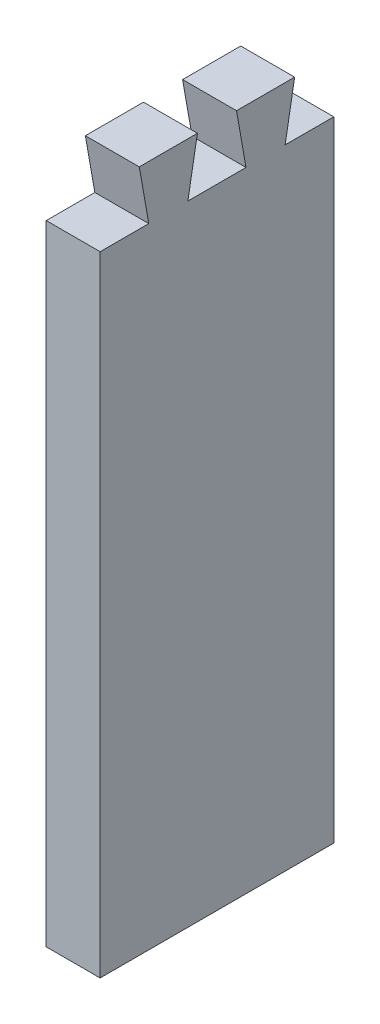
ISO-10303-21;
HEADER;
FILE_DESCRIPTION(('STEP AP214'),'2;1');
FILE_NAME('part.step','',(''),(''),'','','');
FILE_SCHEMA(('AUTOMOTIVE_DESIGN { 1 0 10303 214 1 1 1 1 }'));
ENDSEC;
DATA;
#1=APPLICATION_CONTEXT('core data for automotive mechanical design processes');
#2=APPLICATION_PROTOCOL_DEFINITION('international standard','automotive_design',2000,#1);
#3=PRODUCT_CONTEXT('',#1,'mechanical');
#4=PRODUCT('Part','Part','',(#3));
#5=PRODUCT_RELATED_PRODUCT_CATEGORY('part','',(#4));
#6=PRODUCT_DEFINITION_FORMATION('','',#4);
#7=PRODUCT_DEFINITION_CONTEXT('part definition',#1,'design');
#8=PRODUCT_DEFINITION('design','',#6,#7);
#9=PRODUCT_DEFINITION_SHAPE('','',#8);
#10=(LENGTH_UNIT() NAMED_UNIT(*) SI_UNIT(.MILLI.,.METRE.));
#11=(NAMED_UNIT(*) PLANE_ANGLE_UNIT() SI_UNIT($,.RADIAN.));
#12=(NAMED_UNIT(*) SI_UNIT($,.STERADIAN.) SOLID_ANGLE_UNIT());
#13=UNCERTAINTY_MEASURE_WITH_UNIT(LENGTH_MEASURE(1.E-05),#10,'distance_accuracy_value','');
#14=(GEOMETRIC_REPRESENTATION_CONTEXT(3) GLOBAL_UNCERTAINTY_ASSIGNED_CONTEXT((#13)) GLOBAL_UNIT_ASSIGNED_CONTEXT((#10,
#11,#12)) REPRESENTATION_CONTEXT('',''));
#15=CARTESIAN_POINT('',(0.,0.,0.));
#16=DIRECTION('',(0.,0.,1.));
#17=DIRECTION('',(1.,0.,0.));
#18=AXIS2_PLACEMENT_3D('',#15,#16,#17);
#19=CARTESIAN_POINT('',(-3.,-155.,0.));
#20=DIRECTION('',(0.,-1.,0.));
#21=DIRECTION('',(0.,0.,-1.));
#22=AXIS2_PLACEMENT_3D('',#19,#20,#21);
#23=PLANE('',#22);
#24=DIRECTION('',(0.,0.,-1.));
#25=VECTOR('',#24,1.);
#26=CARTESIAN_POINT('',(-3.,-155.,0.));
#27=LINE('',#26,#25);
#28=CARTESIAN_POINT('',(-3.,-155.,51.66));
#29=VERTEX_POINT('',#28);
#30=CARTESIAN_POINT('',(-3.,-155.,51.46));
#31=VERTEX_POINT('',#30);
#32=EDGE_CURVE('E109',#29,#31,#27,.T.);
#33=ORIENTED_EDGE('',*,*,#32,.T.);
#34=CARTESIAN_POINT('',(0.,-155.,51.46));
#35=DIRECTION('',(0.,-1.,0.));
#36=DIRECTION('',(0.,0.,-1.));
#37=AXIS2_PLACEMENT_3D('',#34,#35,#36);
#38=CIRCLE('',#37,3.);
#39=CARTESIAN_POINT('',(0.,-155.,48.46));
#40=VERTEX_POINT('',#39);
#41=EDGE_CURVE('E104',#31,#40,#38,.T.);
#42=ORIENTED_EDGE('',*,*,#41,.T.);
#43=DIRECTION('',(0.,0.,-1.));
#44=VECTOR('',#43,1.);
#45=CARTESIAN_POINT('',(0.,-155.,0.));
#46=LINE('',#45,#44);
#47=CARTESIAN_POINT('',(0.,-155.,54.66));
#48=VERTEX_POINT('',#47);
#49=EDGE_CURVE('E97',#48,#40,#46,.T.);
#50=ORIENTED_EDGE('',*,*,#49,.F.);
#51=CARTESIAN_POINT('',(0.,-155.,51.66));
#52=DIRECTION('',(0.,-1.,0.));
#53=DIRECTION('',(0.,0.,-1.));
#54=AXIS2_PLACEMENT_3D('',#51,#52,#53);
#55=CIRCLE('',#54,3.);
#56=EDGE_CURVE('E106',#48,#29,#55,.T.);
#57=ORIENTED_EDGE('',*,*,#56,.T.);
#58=EDGE_LOOP('',(#33,#42,#50,#57));
#59=FACE_BOUND('',#58,.T.);
#60=ADVANCED_FACE('F45',(#59),#23,.T.);
#61=CARTESIAN_POINT('',(-3.,155.,0.));
#62=DIRECTION('',(0.,-1.,0.));
#63=DIRECTION('',(0.,0.,-1.));
#64=AXIS2_PLACEMENT_3D('',#61,#62,#63);
#65=PLANE('',#64);
#66=DIRECTION('',(0.,0.,-1.));
#67=VECTOR('',#66,1.);
#68=CARTESIAN_POINT('',(0.,155.,0.));
#69=LINE('',#68,#67);
#70=CARTESIAN_POINT('',(0.,155.,54.66));
#71=VERTEX_POINT('',#70);
#72=CARTESIAN_POINT('',(0.,155.,48.46));
#73=VERTEX_POINT('',#72);
#74=EDGE_CURVE('E83',#71,#73,#69,.T.);
#75=ORIENTED_EDGE('',*,*,#74,.T.);
#76=CARTESIAN_POINT('',(0.,155.,51.46));
#77=DIRECTION('',(0.,-1.,0.));
#78=DIRECTION('',(0.,0.,-1.));
#79=AXIS2_PLACEMENT_3D('',#76,#77,#78);
#80=CIRCLE('',#79,3.);
#81=CARTESIAN_POINT('',(-3.,155.,51.46));
#82=VERTEX_POINT('',#81);
#83=EDGE_CURVE('E12',#73,#82,#80,.F.);
#84=ORIENTED_EDGE('',*,*,#83,.T.);
#85=DIRECTION('',(0.,0.,-1.));
#86=VECTOR('',#85,1.);
#87=CARTESIAN_POINT('',(-3.,155.,0.));
#88=LINE('',#87,#86);
#89=CARTESIAN_POINT('',(-3.,155.,51.66));
#90=VERTEX_POINT('',#89);
#91=EDGE_CURVE('E114',#90,#82,#88,.T.);
#92=ORIENTED_EDGE('',*,*,#91,.F.);
#93=CARTESIAN_POINT('',(0.,155.,51.66));
#94=DIRECTION('',(0.,-1.,0.));
#95=DIRECTION('',(0.,0.,-1.));
#96=AXIS2_PLACEMENT_3D('',#93,#94,#95);
#97=CIRCLE('',#96,3.);
#98=EDGE_CURVE('E53',#90,#71,#97,.F.);
#99=ORIENTED_EDGE('',*,*,#98,.T.);
#100=EDGE_LOOP('',(#75,#84,#92,#99));
#101=FACE_BOUND('',#100,.T.);
#102=ADVANCED_FACE('F85',(#101),#65,.F.);
#103=CARTESIAN_POINT('',(-3.,0.,0.));
#104=DIRECTION('',(1.,0.,0.));
#105=DIRECTION('',(0.,0.,-1.));
#106=AXIS2_PLACEMENT_3D('',#103,#104,#105);
#107=PLANE('',#106);
#108=ORIENTED_EDGE('',*,*,#91,.T.);
#109=DIRECTION('',(0.,-1.,0.));
#110=VECTOR('',#109,1.);
#111=CARTESIAN_POINT('',(-3.,0.,51.46));
#112=LINE('',#111,#110);
#113=EDGE_CURVE('E103',#82,#31,#112,.T.);
#114=ORIENTED_EDGE('',*,*,#113,.T.);
#115=ORIENTED_EDGE('',*,*,#32,.F.);
#116=DIRECTION('',(0.,-1.,0.));
#117=VECTOR('',#116,1.);
#118=CARTESIAN_POINT('',(-3.,155.,51.66));
#119=LINE('',#118,#117);
#120=EDGE_CURVE('E65',#29,#90,#119,.F.);
#121=ORIENTED_EDGE('',*,*,#120,.T.);
#122=EDGE_LOOP('',(#108,#114,#115,#121));
#123=FACE_BOUND('',#122,.T.);
#124=ADVANCED_FACE('F128',(#123),#107,.F.);
#125=CARTESIAN_POINT('',(0.,0.,0.));
#126=DIRECTION('',(1.,0.,0.));
#127=DIRECTION('',(0.,0.,-1.));
#128=AXIS2_PLACEMENT_3D('',#125,#126,#127);
#129=PLANE('',#128);
#130=DIRECTION('',(0.,-1.,0.));
#131=VECTOR('',#130,1.);
#132=CARTESIAN_POINT('',(0.,0.,48.46));
#133=LINE('',#132,#131);
#134=EDGE_CURVE('E91',#73,#40,#133,.T.);
#135=ORIENTED_EDGE('',*,*,#134,.F.);
#136=ORIENTED_EDGE('',*,*,#74,.F.);
#137=DIRECTION('',(0.,-1.,0.));
#138=VECTOR('',#137,1.);
#139=CARTESIAN_POINT('',(0.,0.,54.66));
#140=LINE('',#139,#138);
#141=EDGE_CURVE('E90',#71,#48,#140,.T.);
#142=ORIENTED_EDGE('',*,*,#141,.T.);
#143=ORIENTED_EDGE('',*,*,#49,.T.);
#144=EDGE_LOOP('',(#135,#136,#142,#143));
#145=FACE_BOUND('',#144,.T.);
#146=ADVANCED_FACE('F95',(#145),#129,.T.);
#147=CARTESIAN_POINT('',(0.,0.,51.46));
#148=DIRECTION('',(0.,-1.,0.));
#149=DIRECTION('',(0.,0.,-1.));
#150=AXIS2_PLACEMENT_3D('',#147,#148,#149);
#151=CYLINDRICAL_SURFACE('',#150,3.);
#152=ORIENTED_EDGE('',*,*,#83,.F.);
#153=ORIENTED_EDGE('',*,*,#134,.T.);
#154=ORIENTED_EDGE('',*,*,#41,.F.);
#155=ORIENTED_EDGE('',*,*,#113,.F.);
#156=EDGE_LOOP('',(#152,#153,#154,#155));
#157=FACE_BOUND('',#156,.T.);
#158=ADVANCED_FACE('F101',(#157),#151,.T.);
#159=CARTESIAN_POINT('',(0.,0.,51.66));
#160=DIRECTION('',(0.,1.,0.));
#161=DIRECTION('',(0.,0.,1.));
#162=AXIS2_PLACEMENT_3D('',#159,#160,#161);
#163=CYLINDRICAL_SURFACE('',#162,3.);
#164=ORIENTED_EDGE('',*,*,#98,.F.);
#165=ORIENTED_EDGE('',*,*,#120,.F.);
#166=ORIENTED_EDGE('',*,*,#56,.F.);
#167=ORIENTED_EDGE('',*,*,#141,.F.);
#168=EDGE_LOOP('',(#164,#165,#166,#167));
#169=FACE_BOUND('',#168,.T.);
#170=ADVANCED_FACE('F47',(#169),#163,.T.);
#171=CLOSED_SHELL('',(#60,#102,#124,#146,#158,#170));
#172=MANIFOLD_SOLID_BREP('B2',#171);
#173=CARTESIAN_POINT('',(-30.,0.,0.));
#174=DIRECTION('',(1.,0.,0.));
#175=DIRECTION('',(0.,0.,-1.));
#176=AXIS2_PLACEMENT_3D('',#173,#174,#175);
#177=PLANE('',#176);
#178=DIRECTION('',(0.,0.,-1.));
#179=VECTOR('',#178,1.);
#180=CARTESIAN_POINT('',(-30.,130.,0.));
#181=LINE('',#180,#179);
#182=CARTESIAN_POINT('',(-30.,130.,-38.65));
#183=VERTEX_POINT('',#182);
#184=CARTESIAN_POINT('',(-30.,130.,-48.65));
#185=VERTEX_POINT('',#184);
#186=EDGE_CURVE('E371',#183,#185,#181,.T.);
#187=ORIENTED_EDGE('',*,*,#186,.T.);
#188=DIRECTION('',(0.,1.,0.));
#189=VECTOR('',#188,1.);
#190=CARTESIAN_POINT('',(-30.,-160.,-48.65));
#191=LINE('',#190,#189);
#192=CARTESIAN_POINT('',(-30.,-160.,-48.65));
#193=VERTEX_POINT('',#192);
#194=EDGE_CURVE('E329',#193,#185,#191,.T.);
#195=ORIENTED_EDGE('',*,*,#194,.F.);
#196=DIRECTION('',(0.,0.,-1.));
#197=VECTOR('',#196,1.);
#198=CARTESIAN_POINT('',(-30.,-160.,0.));
#199=LINE('',#198,#197);
#200=CARTESIAN_POINT('',(-30.,-160.,-38.65));
#201=VERTEX_POINT('',#200);
#202=EDGE_CURVE('E364',#201,#193,#199,.T.);
#203=ORIENTED_EDGE('',*,*,#202,.F.);
#204=DIRECTION('',(0.,1.,0.));
#205=VECTOR('',#204,1.);
#206=CARTESIAN_POINT('',(-30.,0.,-38.65));
#207=LINE('',#206,#205);
#208=EDGE_CURVE('E360',#201,#183,#207,.T.);
#209=ORIENTED_EDGE('',*,*,#208,.T.);
#210=EDGE_LOOP('',(#187,#195,#203,#209));
#211=FACE_BOUND('',#210,.T.);
#212=ADVANCED_FACE('F169',(#211),#177,.F.);
#213=CARTESIAN_POINT('',(0.,0.,0.));
#214=DIRECTION('',(1.,0.,0.));
#215=DIRECTION('',(0.,0.,-1.));
#216=AXIS2_PLACEMENT_3D('',#213,#214,#215);
#217=PLANE('',#216);
#218=DIRECTION('',(0.,1.,0.));
#219=VECTOR('',#218,1.);
#220=CARTESIAN_POINT('',(0.,0.,-38.65));
#221=LINE('',#220,#219);
#222=CARTESIAN_POINT('',(0.,-160.,-38.65));
#223=VERTEX_POINT('',#222);
#224=CARTESIAN_POINT('',(0.,130.,-38.65));
#225=VERTEX_POINT('',#224);
#226=EDGE_CURVE('E355',#223,#225,#221,.T.);
#227=ORIENTED_EDGE('',*,*,#226,.F.);
#228=DIRECTION('',(0.,0.,-1.));
#229=VECTOR('',#228,1.);
#230=CARTESIAN_POINT('',(0.,-160.,0.));
#231=LINE('',#230,#229);
#232=CARTESIAN_POINT('',(0.,-160.,35.));
#233=VERTEX_POINT('',#232);
#234=EDGE_CURVE('E379',#233,#223,#231,.T.);
#235=ORIENTED_EDGE('',*,*,#234,.F.);
#236=DIRECTION('',(0.,-1.,0.));
#237=VECTOR('',#236,1.);
#238=CARTESIAN_POINT('',(0.,0.,35.));
#239=LINE('',#238,#237);
#240=CARTESIAN_POINT('',(0.,-175.,35.));
#241=VERTEX_POINT('',#240);
#242=EDGE_CURVE('E400',#233,#241,#239,.T.);
#243=ORIENTED_EDGE('',*,*,#242,.T.);
#244=DIRECTION('',(0.,0.,1.));
#245=VECTOR('',#244,1.);
#246=CARTESIAN_POINT('',(0.,-175.,0.));
#247=LINE('',#246,#245);
#248=CARTESIAN_POINT('',(0.,-175.,-65.));
#249=VERTEX_POINT('',#248);
#250=EDGE_CURVE('E389',#249,#241,#247,.T.);
#251=ORIENTED_EDGE('',*,*,#250,.F.);
#252=DIRECTION('',(0.,1.,0.));
#253=VECTOR('',#252,1.);
#254=CARTESIAN_POINT('',(0.,0.,-65.));
#255=LINE('',#254,#253);
#256=CARTESIAN_POINT('',(0.,-190.,-65.));
#257=VERTEX_POINT('',#256);
#258=EDGE_CURVE('E449',#257,#249,#255,.T.);
#259=ORIENTED_EDGE('',*,*,#258,.F.);
#260=DIRECTION('',(0.,0.,-1.));
#261=VECTOR('',#260,1.);
#262=CARTESIAN_POINT('',(0.,-190.,0.));
#263=LINE('',#262,#261);
#264=CARTESIAN_POINT('',(0.,-190.,65.));
#265=VERTEX_POINT('',#264);
#266=EDGE_CURVE('E413',#265,#257,#263,.T.);
#267=ORIENTED_EDGE('',*,*,#266,.F.);
#268=DIRECTION('',(0.,1.,0.));
#269=VECTOR('',#268,1.);
#270=CARTESIAN_POINT('',(0.,0.,65.));
#271=LINE('',#270,#269);
#272=CARTESIAN_POINT('',(0.,160.,65.));
#273=VERTEX_POINT('',#272);
#274=EDGE_CURVE('E418',#265,#273,#271,.T.);
#275=ORIENTED_EDGE('',*,*,#274,.T.);
#276=DIRECTION('',(0.,0.,-1.));
#277=VECTOR('',#276,1.);
#278=CARTESIAN_POINT('',(0.,160.,0.));
#279=LINE('',#278,#277);
#280=CARTESIAN_POINT('',(0.,160.,37.942));
#281=VERTEX_POINT('',#280);
#282=EDGE_CURVE('E456',#273,#281,#279,.T.);
#283=ORIENTED_EDGE('',*,*,#282,.T.);
#284=DIRECTION('',(0.,0.984806683136138,0.173654245126339));
#285=VECTOR('',#284,1.);
#286=CARTESIAN_POINT('',(0.,-1.66375630789363,9.4352909710414));
#287=LINE('',#286,#285);
#288=CARTESIAN_POINT('',(0.,190.,43.232));
#289=VERTEX_POINT('',#288);
#290=EDGE_CURVE('E472',#281,#289,#287,.T.);
#291=ORIENTED_EDGE('',*,*,#290,.T.);
#292=DIRECTION('',(0.,0.,-1.));
#293=VECTOR('',#292,1.);
#294=CARTESIAN_POINT('',(0.,190.,0.));
#295=LINE('',#294,#293);
#296=CARTESIAN_POINT('',(0.,190.,10.884));
#297=VERTEX_POINT('',#296);
#298=EDGE_CURVE('E469',#289,#297,#295,.T.);
#299=ORIENTED_EDGE('',*,*,#298,.T.);
#300=DIRECTION('',(0.,-0.984806683136138,0.173654245126339));
#301=VECTOR('',#300,1.);
#302=CARTESIAN_POINT('',(0.,7.5909380343909,43.0487979266024));
#303=LINE('',#302,#301);
#304=CARTESIAN_POINT('',(0.,160.,16.174));
#305=VERTEX_POINT('',#304);
#306=EDGE_CURVE('E466',#297,#305,#303,.T.);
#307=ORIENTED_EDGE('',*,*,#306,.T.);
#308=CARTESIAN_POINT('',(0.,160.,-16.174));
#309=VERTEX_POINT('',#308);
#310=EDGE_CURVE('E457',#305,#309,#279,.T.);
#311=ORIENTED_EDGE('',*,*,#310,.T.);
#312=DIRECTION('',(0.,-0.984806683136138,-0.173654245126339));
#313=VECTOR('',#312,1.);
#314=CARTESIAN_POINT('',(0.,7.59093803439089,-43.0487979266024));
#315=LINE('',#314,#313);
#316=CARTESIAN_POINT('',(0.,190.,-10.884));
#317=VERTEX_POINT('',#316);
#318=EDGE_CURVE('E463',#317,#309,#315,.T.);
#319=ORIENTED_EDGE('',*,*,#318,.F.);
#320=DIRECTION('',(0.,0.,-1.));
#321=VECTOR('',#320,1.);
#322=CARTESIAN_POINT('',(0.,190.,0.));
#323=LINE('',#322,#321);
#324=CARTESIAN_POINT('',(0.,190.,-43.232));
#325=VERTEX_POINT('',#324);
#326=EDGE_CURVE('E460',#317,#325,#323,.T.);
#327=ORIENTED_EDGE('',*,*,#326,.T.);
#328=DIRECTION('',(0.,-0.984806683136138,0.173654245126339));
#329=VECTOR('',#328,1.);
#330=CARTESIAN_POINT('',(0.,-1.66375630789364,-9.43529097104146));
#331=LINE('',#330,#329);
#332=CARTESIAN_POINT('',(0.,160.,-37.942));
#333=VERTEX_POINT('',#332);
#334=EDGE_CURVE('E455',#325,#333,#331,.T.);
#335=ORIENTED_EDGE('',*,*,#334,.T.);
#336=CARTESIAN_POINT('',(0.,160.,-65.));
#337=VERTEX_POINT('',#336);
#338=EDGE_CURVE('E452',#333,#337,#279,.T.);
#339=ORIENTED_EDGE('',*,*,#338,.T.);
#340=CARTESIAN_POINT('',(0.,130.,-65.));
#341=VERTEX_POINT('',#340);
#342=EDGE_CURVE('E448',#341,#337,#255,.T.);
#343=ORIENTED_EDGE('',*,*,#342,.F.);
#344=DIRECTION('',(0.,0.,-1.));
#345=VECTOR('',#344,1.);
#346=CARTESIAN_POINT('',(0.,130.,0.));
#347=LINE('',#346,#345);
#348=EDGE_CURVE('E192',#225,#341,#347,.T.);
#349=ORIENTED_EDGE('',*,*,#348,.F.);
#350=EDGE_LOOP('',(#227,#235,#243,#251,#259,#267,#275,#283,#291,#299,#307,#311,#319,#327,#335,
#339,#343,#349));
#351=FACE_BOUND('',#350,.T.);
#352=ADVANCED_FACE('F502',(#351),#217,.F.);
#353=CARTESIAN_POINT('',(30.,-190.,0.));
#354=DIRECTION('',(0.,1.,0.));
#355=DIRECTION('',(0.,0.,1.));
#356=AXIS2_PLACEMENT_3D('',#353,#354,#355);
#357=PLANE('',#356);
#358=ORIENTED_EDGE('',*,*,#266,.T.);
#359=DIRECTION('',(-1.,0.,0.));
#360=VECTOR('',#359,1.);
#361=CARTESIAN_POINT('',(30.,-190.,-65.));
#362=LINE('',#361,#360);
#363=CARTESIAN_POINT('',(30.,-190.,-65.));
#364=VERTEX_POINT('',#363);
#365=EDGE_CURVE('E43',#364,#257,#362,.T.);
#366=ORIENTED_EDGE('',*,*,#365,.F.);
#367=DIRECTION('',(0.,0.,-1.));
#368=VECTOR('',#367,1.);
#369=CARTESIAN_POINT('',(30.,-190.,0.));
#370=LINE('',#369,#368);
#371=CARTESIAN_POINT('',(30.,-190.,65.));
#372=VERTEX_POINT('',#371);
#373=EDGE_CURVE('E414',#372,#364,#370,.T.);
#374=ORIENTED_EDGE('',*,*,#373,.F.);
#375=DIRECTION('',(-1.,0.,0.));
#376=VECTOR('',#375,1.);
#377=CARTESIAN_POINT('',(30.,-190.,65.));
#378=LINE('',#377,#376);
#379=EDGE_CURVE('E445',#372,#265,#378,.T.);
#380=ORIENTED_EDGE('',*,*,#379,.T.);
#381=EDGE_LOOP('',(#358,#366,#374,#380));
#382=FACE_BOUND('',#381,.T.);
#383=ADVANCED_FACE('F171',(#382),#357,.F.);
#384=CARTESIAN_POINT('',(30.,0.,-65.));
#385=DIRECTION('',(0.,0.,1.));
#386=DIRECTION('',(1.,0.,0.));
#387=AXIS2_PLACEMENT_3D('',#384,#385,#386);
#388=PLANE('',#387);
#389=DIRECTION('',(0.,1.,0.));
#390=VECTOR('',#389,1.);
#391=CARTESIAN_POINT('',(15.,0.,-65.));
#392=LINE('',#391,#390);
#393=CARTESIAN_POINT('',(15.,-175.,-65.));
#394=VERTEX_POINT('',#393);
#395=CARTESIAN_POINT('',(15.,-160.,-65.));
#396=VERTEX_POINT('',#395);
#397=EDGE_CURVE('E394',#394,#396,#392,.T.);
#398=ORIENTED_EDGE('',*,*,#397,.T.);
#399=DIRECTION('',(-1.,0.,0.));
#400=VECTOR('',#399,1.);
#401=CARTESIAN_POINT('',(15.,-160.,-65.));
#402=LINE('',#401,#400);
#403=CARTESIAN_POINT('',(-30.,-160.,-65.));
#404=VERTEX_POINT('',#403);
#405=EDGE_CURVE('E397',#396,#404,#402,.T.);
#406=ORIENTED_EDGE('',*,*,#405,.T.);
#407=DIRECTION('',(0.,1.,0.));
#408=VECTOR('',#407,1.);
#409=CARTESIAN_POINT('',(-30.,0.,-65.));
#410=LINE('',#409,#408);
#411=CARTESIAN_POINT('',(-30.,130.,-65.));
#412=VERTEX_POINT('',#411);
#413=EDGE_CURVE('E367',#404,#412,#410,.T.);
#414=ORIENTED_EDGE('',*,*,#413,.T.);
#415=DIRECTION('',(1.,0.,0.));
#416=VECTOR('',#415,1.);
#417=CARTESIAN_POINT('',(-30.,130.,-65.));
#418=LINE('',#417,#416);
#419=EDGE_CURVE('E380',#412,#341,#418,.T.);
#420=ORIENTED_EDGE('',*,*,#419,.T.);
#421=ORIENTED_EDGE('',*,*,#342,.T.);
#422=DIRECTION('',(-1.,0.,0.));
#423=VECTOR('',#422,1.);
#424=CARTESIAN_POINT('',(30.,160.,-65.));
#425=LINE('',#424,#423);
#426=CARTESIAN_POINT('',(30.,160.,-65.));
#427=VERTEX_POINT('',#426);
#428=EDGE_CURVE('E177',#427,#337,#425,.T.);
#429=ORIENTED_EDGE('',*,*,#428,.F.);
#430=DIRECTION('',(0.,1.,0.));
#431=VECTOR('',#430,1.);
#432=CARTESIAN_POINT('',(30.,0.,-65.));
#433=LINE('',#432,#431);
#434=EDGE_CURVE('E417',#364,#427,#433,.T.);
#435=ORIENTED_EDGE('',*,*,#434,.F.);
#436=ORIENTED_EDGE('',*,*,#365,.T.);
#437=ORIENTED_EDGE('',*,*,#258,.T.);
#438=DIRECTION('',(-1.,0.,0.));
#439=VECTOR('',#438,1.);
#440=CARTESIAN_POINT('',(15.,-175.,-65.));
#441=LINE('',#440,#439);
#442=EDGE_CURVE('E407',#394,#249,#441,.T.);
#443=ORIENTED_EDGE('',*,*,#442,.F.);
#444=EDGE_LOOP('',(#398,#406,#414,#420,#421,#429,#435,#436,#437,#443));
#445=FACE_BOUND('',#444,.T.);
#446=ADVANCED_FACE('F515',(#445),#388,.F.);
#447=CARTESIAN_POINT('',(30.,160.,0.));
#448=DIRECTION('',(0.,1.,0.));
#449=DIRECTION('',(0.,0.,1.));
#450=AXIS2_PLACEMENT_3D('',#447,#448,#449);
#451=PLANE('',#450);
#452=ORIENTED_EDGE('',*,*,#338,.F.);
#453=DIRECTION('',(-1.,0.,0.));
#454=VECTOR('',#453,1.);
#455=CARTESIAN_POINT('',(30.,160.,-37.942));
#456=LINE('',#455,#454);
#457=CARTESIAN_POINT('',(30.,160.,-37.942));
#458=VERTEX_POINT('',#457);
#459=EDGE_CURVE('E494',#458,#333,#456,.T.);
#460=ORIENTED_EDGE('',*,*,#459,.F.);
#461=DIRECTION('',(0.,0.,-1.));
#462=VECTOR('',#461,1.);
#463=CARTESIAN_POINT('',(30.,160.,0.));
#464=LINE('',#463,#462);
#465=EDGE_CURVE('E420',#458,#427,#464,.T.);
#466=ORIENTED_EDGE('',*,*,#465,.T.);
#467=ORIENTED_EDGE('',*,*,#428,.T.);
#468=EDGE_LOOP('',(#452,#460,#466,#467));
#469=FACE_BOUND('',#468,.T.);
#470=ADVANCED_FACE('F499',(#469),#451,.T.);
#471=CARTESIAN_POINT('',(30.,-1.66375630789364,-9.43529097104146));
#472=DIRECTION('',(0.,-0.173654245126339,-0.984806683136138));
#473=DIRECTION('',(0.,0.984806683136138,-0.173654245126339));
#474=AXIS2_PLACEMENT_3D('',#471,#472,#473);
#475=PLANE('',#474);
#476=ORIENTED_EDGE('',*,*,#334,.F.);
#477=DIRECTION('',(-1.,0.,0.));
#478=VECTOR('',#477,1.);
#479=CARTESIAN_POINT('',(30.,190.,-43.232));
#480=LINE('',#479,#478);
#481=CARTESIAN_POINT('',(30.,190.,-43.232));
#482=VERTEX_POINT('',#481);
#483=EDGE_CURVE('E492',#482,#325,#480,.T.);
#484=ORIENTED_EDGE('',*,*,#483,.F.);
#485=DIRECTION('',(0.,-0.984806683136138,0.173654245126339));
#486=VECTOR('',#485,1.);
#487=CARTESIAN_POINT('',(30.,-1.66375630789364,-9.43529097104146));
#488=LINE('',#487,#486);
#489=EDGE_CURVE('E423',#482,#458,#488,.T.);
#490=ORIENTED_EDGE('',*,*,#489,.T.);
#491=ORIENTED_EDGE('',*,*,#459,.T.);
#492=EDGE_LOOP('',(#476,#484,#490,#491));
#493=FACE_BOUND('',#492,.T.);
#494=ADVANCED_FACE('F507',(#493),#475,.T.);
#495=CARTESIAN_POINT('',(30.,190.,0.));
#496=DIRECTION('',(0.,1.,0.));
#497=DIRECTION('',(0.,0.,1.));
#498=AXIS2_PLACEMENT_3D('',#495,#496,#497);
#499=PLANE('',#498);
#500=ORIENTED_EDGE('',*,*,#326,.F.);
#501=DIRECTION('',(-1.,0.,0.));
#502=VECTOR('',#501,1.);
#503=CARTESIAN_POINT('',(30.,190.,-10.884));
#504=LINE('',#503,#502);
#505=CARTESIAN_POINT('',(30.,190.,-10.884));
#506=VERTEX_POINT('',#505);
#507=EDGE_CURVE('E490',#506,#317,#504,.T.);
#508=ORIENTED_EDGE('',*,*,#507,.F.);
#509=DIRECTION('',(0.,0.,-1.));
#510=VECTOR('',#509,1.);
#511=CARTESIAN_POINT('',(30.,190.,0.));
#512=LINE('',#511,#510);
#513=EDGE_CURVE('E428',#506,#482,#512,.T.);
#514=ORIENTED_EDGE('',*,*,#513,.T.);
#515=ORIENTED_EDGE('',*,*,#483,.T.);
#516=EDGE_LOOP('',(#500,#508,#514,#515));
#517=FACE_BOUND('',#516,.T.);
#518=ADVANCED_FACE('F542',(#517),#499,.T.);
#519=CARTESIAN_POINT('',(30.,7.59093803439089,-43.0487979266024));
#520=DIRECTION('',(0.,0.173654245126339,-0.984806683136138));
#521=DIRECTION('',(0.,0.984806683136138,0.173654245126339));
#522=AXIS2_PLACEMENT_3D('',#519,#520,#521);
#523=PLANE('',#522);
#524=ORIENTED_EDGE('',*,*,#318,.T.);
#525=DIRECTION('',(-1.,0.,0.));
#526=VECTOR('',#525,1.);
#527=CARTESIAN_POINT('',(30.,160.,-16.174));
#528=LINE('',#527,#526);
#529=CARTESIAN_POINT('',(30.,160.,-16.174));
#530=VERTEX_POINT('',#529);
#531=EDGE_CURVE('E488',#530,#309,#528,.T.);
#532=ORIENTED_EDGE('',*,*,#531,.F.);
#533=DIRECTION('',(0.,-0.984806683136138,-0.173654245126339));
#534=VECTOR('',#533,1.);
#535=CARTESIAN_POINT('',(30.,7.59093803439089,-43.0487979266024));
#536=LINE('',#535,#534);
#537=EDGE_CURVE('E431',#506,#530,#536,.T.);
#538=ORIENTED_EDGE('',*,*,#537,.F.);
#539=ORIENTED_EDGE('',*,*,#507,.T.);
#540=EDGE_LOOP('',(#524,#532,#538,#539));
#541=FACE_BOUND('',#540,.T.);
#542=ADVANCED_FACE('F540',(#541),#523,.F.);
#543=ORIENTED_EDGE('',*,*,#310,.F.);
#544=DIRECTION('',(-1.,0.,0.));
#545=VECTOR('',#544,1.);
#546=CARTESIAN_POINT('',(30.,160.,16.174));
#547=LINE('',#546,#545);
#548=CARTESIAN_POINT('',(30.,160.,16.174));
#549=VERTEX_POINT('',#548);
#550=EDGE_CURVE('E486',#549,#305,#547,.T.);
#551=ORIENTED_EDGE('',*,*,#550,.F.);
#552=EDGE_CURVE('E425',#549,#530,#464,.T.);
#553=ORIENTED_EDGE('',*,*,#552,.T.);
#554=ORIENTED_EDGE('',*,*,#531,.T.);
#555=EDGE_LOOP('',(#543,#551,#553,#554));
#556=FACE_BOUND('',#555,.T.);
#557=ADVANCED_FACE('F534',(#556),#451,.T.);
#558=CARTESIAN_POINT('',(30.,7.5909380343909,43.0487979266024));
#559=DIRECTION('',(0.,-0.173654245126339,-0.984806683136138));
#560=DIRECTION('',(0.,0.984806683136138,-0.173654245126339));
#561=AXIS2_PLACEMENT_3D('',#558,#559,#560);
#562=PLANE('',#561);
#563=ORIENTED_EDGE('',*,*,#306,.F.);
#564=DIRECTION('',(-1.,0.,0.));
#565=VECTOR('',#564,1.);
#566=CARTESIAN_POINT('',(30.,190.,10.884));
#567=LINE('',#566,#565);
#568=CARTESIAN_POINT('',(30.,190.,10.884));
#569=VERTEX_POINT('',#568);
#570=EDGE_CURVE('E484',#569,#297,#567,.T.);
#571=ORIENTED_EDGE('',*,*,#570,.F.);
#572=DIRECTION('',(0.,-0.984806683136138,0.173654245126339));
#573=VECTOR('',#572,1.);
#574=CARTESIAN_POINT('',(30.,7.5909380343909,43.0487979266024));
#575=LINE('',#574,#573);
#576=EDGE_CURVE('E433',#569,#549,#575,.T.);
#577=ORIENTED_EDGE('',*,*,#576,.T.);
#578=ORIENTED_EDGE('',*,*,#550,.T.);
#579=EDGE_LOOP('',(#563,#571,#577,#578));
#580=FACE_BOUND('',#579,.T.);
#581=ADVANCED_FACE('F546',(#580),#562,.T.);
#582=CARTESIAN_POINT('',(30.,190.,0.));
#583=DIRECTION('',(0.,1.,0.));
#584=DIRECTION('',(0.,0.,1.));
#585=AXIS2_PLACEMENT_3D('',#582,#583,#584);
#586=PLANE('',#585);
#587=ORIENTED_EDGE('',*,*,#298,.F.);
#588=DIRECTION('',(-1.,0.,0.));
#589=VECTOR('',#588,1.);
#590=CARTESIAN_POINT('',(30.,190.,43.232));
#591=LINE('',#590,#589);
#592=CARTESIAN_POINT('',(30.,190.,43.232));
#593=VERTEX_POINT('',#592);
#594=EDGE_CURVE('E482',#593,#289,#591,.T.);
#595=ORIENTED_EDGE('',*,*,#594,.F.);
#596=DIRECTION('',(0.,0.,-1.));
#597=VECTOR('',#596,1.);
#598=CARTESIAN_POINT('',(30.,190.,0.));
#599=LINE('',#598,#597);
#600=EDGE_CURVE('E436',#593,#569,#599,.T.);
#601=ORIENTED_EDGE('',*,*,#600,.T.);
#602=ORIENTED_EDGE('',*,*,#570,.T.);
#603=EDGE_LOOP('',(#587,#595,#601,#602));
#604=FACE_BOUND('',#603,.T.);
#605=ADVANCED_FACE('F549',(#604),#586,.T.);
#606=CARTESIAN_POINT('',(30.,-1.66375630789363,9.4352909710414));
#607=DIRECTION('',(0.,-0.173654245126339,0.984806683136138));
#608=DIRECTION('',(0.,-0.984806683136138,-0.173654245126339));
#609=AXIS2_PLACEMENT_3D('',#606,#607,#608);
#610=PLANE('',#609);
#611=ORIENTED_EDGE('',*,*,#290,.F.);
#612=DIRECTION('',(-1.,0.,0.));
#613=VECTOR('',#612,1.);
#614=CARTESIAN_POINT('',(30.,160.,37.942));
#615=LINE('',#614,#613);
#616=CARTESIAN_POINT('',(30.,160.,37.942));
#617=VERTEX_POINT('',#616);
#618=EDGE_CURVE('E480',#617,#281,#615,.T.);
#619=ORIENTED_EDGE('',*,*,#618,.F.);
#620=DIRECTION('',(0.,0.984806683136138,0.173654245126339));
#621=VECTOR('',#620,1.);
#622=CARTESIAN_POINT('',(30.,-1.66375630789363,9.4352909710414));
#623=LINE('',#622,#621);
#624=EDGE_CURVE('E439',#617,#593,#623,.T.);
#625=ORIENTED_EDGE('',*,*,#624,.T.);
#626=ORIENTED_EDGE('',*,*,#594,.T.);
#627=EDGE_LOOP('',(#611,#619,#625,#626));
#628=FACE_BOUND('',#627,.T.);
#629=ADVANCED_FACE('F552',(#628),#610,.T.);
#630=ORIENTED_EDGE('',*,*,#282,.F.);
#631=DIRECTION('',(-1.,0.,0.));
#632=VECTOR('',#631,1.);
#633=CARTESIAN_POINT('',(30.,160.,65.));
#634=LINE('',#633,#632);
#635=CARTESIAN_POINT('',(30.,160.,65.));
#636=VERTEX_POINT('',#635);
#637=EDGE_CURVE('E478',#636,#273,#634,.T.);
#638=ORIENTED_EDGE('',*,*,#637,.F.);
#639=EDGE_CURVE('E424',#636,#617,#464,.T.);
#640=ORIENTED_EDGE('',*,*,#639,.T.);
#641=ORIENTED_EDGE('',*,*,#618,.T.);
#642=EDGE_LOOP('',(#630,#638,#640,#641));
#643=FACE_BOUND('',#642,.T.);
#644=ADVANCED_FACE('F528',(#643),#451,.T.);
#645=CARTESIAN_POINT('',(30.,0.,65.));
#646=DIRECTION('',(0.,0.,1.));
#647=DIRECTION('',(1.,0.,0.));
#648=AXIS2_PLACEMENT_3D('',#645,#646,#647);
#649=PLANE('',#648);
#650=ORIENTED_EDGE('',*,*,#274,.F.);
#651=ORIENTED_EDGE('',*,*,#379,.F.);
#652=DIRECTION('',(0.,1.,0.));
#653=VECTOR('',#652,1.);
#654=CARTESIAN_POINT('',(30.,0.,65.));
#655=LINE('',#654,#653);
#656=EDGE_CURVE('E442',#372,#636,#655,.T.);
#657=ORIENTED_EDGE('',*,*,#656,.T.);
#658=ORIENTED_EDGE('',*,*,#637,.T.);
#659=EDGE_LOOP('',(#650,#651,#657,#658));
#660=FACE_BOUND('',#659,.T.);
#661=ADVANCED_FACE('F523',(#660),#649,.T.);
#662=CARTESIAN_POINT('',(30.,0.,0.));
#663=DIRECTION('',(1.,0.,0.));
#664=DIRECTION('',(0.,0.,-1.));
#665=AXIS2_PLACEMENT_3D('',#662,#663,#664);
#666=PLANE('',#665);
#667=ORIENTED_EDGE('',*,*,#373,.T.);
#668=ORIENTED_EDGE('',*,*,#434,.T.);
#669=ORIENTED_EDGE('',*,*,#465,.F.);
#670=ORIENTED_EDGE('',*,*,#489,.F.);
#671=ORIENTED_EDGE('',*,*,#513,.F.);
#672=ORIENTED_EDGE('',*,*,#537,.T.);
#673=ORIENTED_EDGE('',*,*,#552,.F.);
#674=ORIENTED_EDGE('',*,*,#576,.F.);
#675=ORIENTED_EDGE('',*,*,#600,.F.);
#676=ORIENTED_EDGE('',*,*,#624,.F.);
#677=ORIENTED_EDGE('',*,*,#639,.F.);
#678=ORIENTED_EDGE('',*,*,#656,.F.);
#679=EDGE_LOOP('',(#667,#668,#669,#670,#671,#672,#673,#674,#675,#676,#677,#678));
#680=FACE_BOUND('',#679,.T.);
#681=ADVANCED_FACE('F510',(#680),#666,.T.);
#682=CARTESIAN_POINT('',(15.,-160.,0.));
#683=DIRECTION('',(0.,1.,0.));
#684=DIRECTION('',(0.,0.,1.));
#685=AXIS2_PLACEMENT_3D('',#682,#683,#684);
#686=PLANE('',#685);
#687=ORIENTED_EDGE('',*,*,#202,.T.);
#688=DIRECTION('',(-1.,0.,0.));
#689=VECTOR('',#688,1.);
#690=CARTESIAN_POINT('',(-15.,-160.,-48.65));
#691=LINE('',#690,#689);
#692=CARTESIAN_POINT('',(-15.,-160.,-48.65));
#693=VERTEX_POINT('',#692);
#694=EDGE_CURVE('E353',#693,#193,#691,.T.);
#695=ORIENTED_EDGE('',*,*,#694,.F.);
#696=DIRECTION('',(0.,0.,1.));
#697=VECTOR('',#696,1.);
#698=CARTESIAN_POINT('',(-15.,-160.,-48.65));
#699=LINE('',#698,#697);
#700=CARTESIAN_POINT('',(-15.,-160.,-55.));
#701=VERTEX_POINT('',#700);
#702=EDGE_CURVE('E333',#701,#693,#699,.T.);
#703=ORIENTED_EDGE('',*,*,#702,.F.);
#704=DIRECTION('',(-1.,0.,0.));
#705=VECTOR('',#704,1.);
#706=CARTESIAN_POINT('',(-15.,-160.,-55.));
#707=LINE('',#706,#705);
#708=CARTESIAN_POINT('',(-30.,-160.,-55.));
#709=VERTEX_POINT('',#708);
#710=EDGE_CURVE('E356',#701,#709,#707,.T.);
#711=ORIENTED_EDGE('',*,*,#710,.T.);
#712=EDGE_CURVE('E363',#709,#404,#199,.T.);
#713=ORIENTED_EDGE('',*,*,#712,.T.);
#714=ORIENTED_EDGE('',*,*,#405,.F.);
#715=DIRECTION('',(0.,0.,-1.));
#716=VECTOR('',#715,1.);
#717=CARTESIAN_POINT('',(15.,-160.,0.));
#718=LINE('',#717,#716);
#719=CARTESIAN_POINT('',(15.,-160.,35.));
#720=VERTEX_POINT('',#719);
#721=EDGE_CURVE('E385',#720,#396,#718,.T.);
#722=ORIENTED_EDGE('',*,*,#721,.F.);
#723=DIRECTION('',(-1.,0.,0.));
#724=VECTOR('',#723,1.);
#725=CARTESIAN_POINT('',(15.,-160.,35.));
#726=LINE('',#725,#724);
#727=EDGE_CURVE('E411',#720,#233,#726,.T.);
#728=ORIENTED_EDGE('',*,*,#727,.T.);
#729=ORIENTED_EDGE('',*,*,#234,.T.);
#730=DIRECTION('',(1.,0.,0.));
#731=VECTOR('',#730,1.);
#732=CARTESIAN_POINT('',(-30.,-160.,-38.65));
#733=LINE('',#732,#731);
#734=EDGE_CURVE('E373',#201,#223,#733,.T.);
#735=ORIENTED_EDGE('',*,*,#734,.F.);
#736=EDGE_LOOP('',(#687,#695,#703,#711,#713,#714,#722,#728,#729,#735));
#737=FACE_BOUND('',#736,.T.);
#738=ADVANCED_FACE('F582',(#737),#686,.F.);
#739=CARTESIAN_POINT('',(15.,0.,35.));
#740=DIRECTION('',(0.,0.,-1.));
#741=DIRECTION('',(-1.,0.,0.));
#742=AXIS2_PLACEMENT_3D('',#739,#740,#741);
#743=PLANE('',#742);
#744=ORIENTED_EDGE('',*,*,#242,.F.);
#745=ORIENTED_EDGE('',*,*,#727,.F.);
#746=DIRECTION('',(0.,-1.,0.));
#747=VECTOR('',#746,1.);
#748=CARTESIAN_POINT('',(15.,0.,35.));
#749=LINE('',#748,#747);
#750=CARTESIAN_POINT('',(15.,-175.,35.));
#751=VERTEX_POINT('',#750);
#752=EDGE_CURVE('E388',#720,#751,#749,.T.);
#753=ORIENTED_EDGE('',*,*,#752,.T.);
#754=DIRECTION('',(-1.,0.,0.));
#755=VECTOR('',#754,1.);
#756=CARTESIAN_POINT('',(15.,-175.,35.));
#757=LINE('',#756,#755);
#758=EDGE_CURVE('E409',#751,#241,#757,.T.);
#759=ORIENTED_EDGE('',*,*,#758,.T.);
#760=EDGE_LOOP('',(#744,#745,#753,#759));
#761=FACE_BOUND('',#760,.T.);
#762=ADVANCED_FACE('F593',(#761),#743,.T.);
#763=CARTESIAN_POINT('',(15.,-175.,0.));
#764=DIRECTION('',(0.,-1.,0.));
#765=DIRECTION('',(0.,0.,-1.));
#766=AXIS2_PLACEMENT_3D('',#763,#764,#765);
#767=PLANE('',#766);
#768=ORIENTED_EDGE('',*,*,#250,.T.);
#769=ORIENTED_EDGE('',*,*,#758,.F.);
#770=DIRECTION('',(0.,0.,1.));
#771=VECTOR('',#770,1.);
#772=CARTESIAN_POINT('',(15.,-175.,0.));
#773=LINE('',#772,#771);
#774=EDGE_CURVE('E391',#394,#751,#773,.T.);
#775=ORIENTED_EDGE('',*,*,#774,.F.);
#776=ORIENTED_EDGE('',*,*,#442,.T.);
#777=EDGE_LOOP('',(#768,#769,#775,#776));
#778=FACE_BOUND('',#777,.T.);
#779=ADVANCED_FACE('F590',(#778),#767,.F.);
#780=CARTESIAN_POINT('',(15.,0.,0.));
#781=DIRECTION('',(1.,0.,0.));
#782=DIRECTION('',(0.,0.,-1.));
#783=AXIS2_PLACEMENT_3D('',#780,#781,#782);
#784=PLANE('',#783);
#785=ORIENTED_EDGE('',*,*,#721,.T.);
#786=ORIENTED_EDGE('',*,*,#397,.F.);
#787=ORIENTED_EDGE('',*,*,#774,.T.);
#788=ORIENTED_EDGE('',*,*,#752,.F.);
#789=EDGE_LOOP('',(#785,#786,#787,#788));
#790=FACE_BOUND('',#789,.T.);
#791=ADVANCED_FACE('F586',(#790),#784,.F.);
#792=CARTESIAN_POINT('',(-30.,0.,-38.65));
#793=DIRECTION('',(0.,0.,-1.));
#794=DIRECTION('',(-1.,0.,0.));
#795=AXIS2_PLACEMENT_3D('',#792,#793,#794);
#796=PLANE('',#795);
#797=ORIENTED_EDGE('',*,*,#226,.T.);
#798=DIRECTION('',(1.,0.,0.));
#799=VECTOR('',#798,1.);
#800=CARTESIAN_POINT('',(-30.,130.,-38.65));
#801=LINE('',#800,#799);
#802=EDGE_CURVE('E377',#183,#225,#801,.T.);
#803=ORIENTED_EDGE('',*,*,#802,.F.);
#804=ORIENTED_EDGE('',*,*,#208,.F.);
#805=ORIENTED_EDGE('',*,*,#734,.T.);
#806=EDGE_LOOP('',(#797,#803,#804,#805));
#807=FACE_BOUND('',#806,.T.);
#808=ADVANCED_FACE('F578',(#807),#796,.F.);
#809=CARTESIAN_POINT('',(-30.,130.,0.));
#810=DIRECTION('',(0.,-1.,0.));
#811=DIRECTION('',(0.,0.,-1.));
#812=AXIS2_PLACEMENT_3D('',#809,#810,#811);
#813=PLANE('',#812);
#814=DIRECTION('',(0.,0.,-1.));
#815=VECTOR('',#814,1.);
#816=CARTESIAN_POINT('',(-15.,130.,-48.65));
#817=LINE('',#816,#815);
#818=CARTESIAN_POINT('',(-15.,130.,-48.65));
#819=VERTEX_POINT('',#818);
#820=CARTESIAN_POINT('',(-15.,130.,-55.));
#821=VERTEX_POINT('',#820);
#822=EDGE_CURVE('E339',#819,#821,#817,.T.);
#823=ORIENTED_EDGE('',*,*,#822,.F.);
#824=DIRECTION('',(-1.,0.,0.));
#825=VECTOR('',#824,1.);
#826=CARTESIAN_POINT('',(-15.,130.,-48.65));
#827=LINE('',#826,#825);
#828=EDGE_CURVE('E323',#819,#185,#827,.T.);
#829=ORIENTED_EDGE('',*,*,#828,.T.);
#830=ORIENTED_EDGE('',*,*,#186,.F.);
#831=ORIENTED_EDGE('',*,*,#802,.T.);
#832=ORIENTED_EDGE('',*,*,#348,.T.);
#833=ORIENTED_EDGE('',*,*,#419,.F.);
#834=CARTESIAN_POINT('',(-30.,130.,-55.));
#835=VERTEX_POINT('',#834);
#836=EDGE_CURVE('E370',#835,#412,#181,.T.);
#837=ORIENTED_EDGE('',*,*,#836,.F.);
#838=DIRECTION('',(-1.,0.,0.));
#839=VECTOR('',#838,1.);
#840=CARTESIAN_POINT('',(-15.,130.,-55.));
#841=LINE('',#840,#839);
#842=EDGE_CURVE('E184',#821,#835,#841,.T.);
#843=ORIENTED_EDGE('',*,*,#842,.F.);
#844=EDGE_LOOP('',(#823,#829,#830,#831,#832,#833,#837,#843));
#845=FACE_BOUND('',#844,.T.);
#846=ADVANCED_FACE('F344',(#845),#813,.F.);
#847=ORIENTED_EDGE('',*,*,#712,.F.);
#848=DIRECTION('',(0.,-1.,0.));
#849=VECTOR('',#848,1.);
#850=CARTESIAN_POINT('',(-30.,-160.,-55.));
#851=LINE('',#850,#849);
#852=EDGE_CURVE('E342',#835,#709,#851,.T.);
#853=ORIENTED_EDGE('',*,*,#852,.F.);
#854=ORIENTED_EDGE('',*,*,#836,.T.);
#855=ORIENTED_EDGE('',*,*,#413,.F.);
#856=EDGE_LOOP('',(#847,#853,#854,#855));
#857=FACE_BOUND('',#856,.T.);
#858=ADVANCED_FACE('F564',(#857),#177,.F.);
#859=CARTESIAN_POINT('',(-15.,-160.,-48.65));
#860=DIRECTION('',(0.,0.,1.));
#861=DIRECTION('',(1.,0.,0.));
#862=AXIS2_PLACEMENT_3D('',#859,#860,#861);
#863=PLANE('',#862);
#864=ORIENTED_EDGE('',*,*,#194,.T.);
#865=ORIENTED_EDGE('',*,*,#828,.F.);
#866=DIRECTION('',(0.,1.,0.));
#867=VECTOR('',#866,1.);
#868=CARTESIAN_POINT('',(-15.,-160.,-48.65));
#869=LINE('',#868,#867);
#870=EDGE_CURVE('E326',#693,#819,#869,.T.);
#871=ORIENTED_EDGE('',*,*,#870,.F.);
#872=ORIENTED_EDGE('',*,*,#694,.T.);
#873=EDGE_LOOP('',(#864,#865,#871,#872));
#874=FACE_BOUND('',#873,.T.);
#875=ADVANCED_FACE('F325',(#874),#863,.F.);
#876=CARTESIAN_POINT('',(-15.,-160.,-55.));
#877=DIRECTION('',(0.,0.,-1.));
#878=DIRECTION('',(-1.,0.,0.));
#879=AXIS2_PLACEMENT_3D('',#876,#877,#878);
#880=PLANE('',#879);
#881=ORIENTED_EDGE('',*,*,#852,.T.);
#882=ORIENTED_EDGE('',*,*,#710,.F.);
#883=DIRECTION('',(0.,-1.,0.));
#884=VECTOR('',#883,1.);
#885=CARTESIAN_POINT('',(-15.,-160.,-55.));
#886=LINE('',#885,#884);
#887=EDGE_CURVE('E346',#821,#701,#886,.T.);
#888=ORIENTED_EDGE('',*,*,#887,.F.);
#889=ORIENTED_EDGE('',*,*,#842,.T.);
#890=EDGE_LOOP('',(#881,#882,#888,#889));
#891=FACE_BOUND('',#890,.T.);
#892=ADVANCED_FACE('F577',(#891),#880,.F.);
#893=CARTESIAN_POINT('',(-15.,0.,0.));
#894=DIRECTION('',(-1.,0.,0.));
#895=DIRECTION('',(0.,0.,1.));
#896=AXIS2_PLACEMENT_3D('',#893,#894,#895);
#897=PLANE('',#896);
#898=ORIENTED_EDGE('',*,*,#870,.T.);
#899=ORIENTED_EDGE('',*,*,#822,.T.);
#900=ORIENTED_EDGE('',*,*,#887,.T.);
#901=ORIENTED_EDGE('',*,*,#702,.T.);
#902=EDGE_LOOP('',(#898,#899,#900,#901));
#903=FACE_BOUND('',#902,.T.);
#904=ADVANCED_FACE('F337',(#903),#897,.T.);
#905=CLOSED_SHELL('',(#212,#352,#383,#446,#470,#494,#518,#542,#557,#581,#605,#629,#644,#661,
#681,#738,#762,#779,#791,#808,#846,#858,#875,#892,#904));
#906=MANIFOLD_SOLID_BREP('B6',#905);
#907=ADVANCED_BREP_SHAPE_REPRESENTATION('',(#18,#172,#906),#14);
#908=SHAPE_DEFINITION_REPRESENTATION(#9,#907);
ENDSEC;
END-ISO-10303-21;
